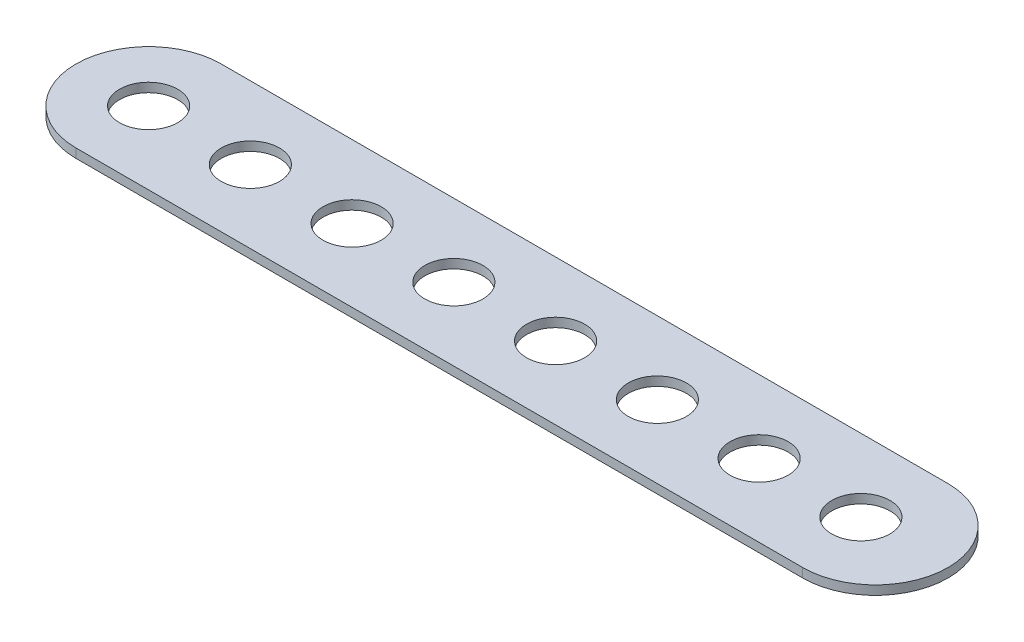
ISO-10303-21;
HEADER;
FILE_DESCRIPTION(('STEP AP214'),'2;1');
FILE_NAME('part.step','',(''),(''),'','','');
FILE_SCHEMA(('AUTOMOTIVE_DESIGN { 1 0 10303 214 1 1 1 1 }'));
ENDSEC;
DATA;
#1=APPLICATION_CONTEXT('core data for automotive mechanical design processes');
#2=APPLICATION_PROTOCOL_DEFINITION('international standard','automotive_design',2000,#1);
#3=PRODUCT_CONTEXT('',#1,'mechanical');
#4=PRODUCT('Part','Part','',(#3));
#5=PRODUCT_RELATED_PRODUCT_CATEGORY('part','',(#4));
#6=PRODUCT_DEFINITION_FORMATION('','',#4);
#7=PRODUCT_DEFINITION_CONTEXT('part definition',#1,'design');
#8=PRODUCT_DEFINITION('design','',#6,#7);
#9=PRODUCT_DEFINITION_SHAPE('','',#8);
#10=(LENGTH_UNIT() NAMED_UNIT(*) SI_UNIT(.MILLI.,.METRE.));
#11=(NAMED_UNIT(*) PLANE_ANGLE_UNIT() SI_UNIT($,.RADIAN.));
#12=(NAMED_UNIT(*) SI_UNIT($,.STERADIAN.) SOLID_ANGLE_UNIT());
#13=UNCERTAINTY_MEASURE_WITH_UNIT(LENGTH_MEASURE(1.E-05),#10,'distance_accuracy_value','');
#14=(GEOMETRIC_REPRESENTATION_CONTEXT(3) GLOBAL_UNCERTAINTY_ASSIGNED_CONTEXT((#13)) GLOBAL_UNIT_ASSIGNED_CONTEXT((#10,
#11,#12)) REPRESENTATION_CONTEXT('',''));
#15=CARTESIAN_POINT('',(0.,0.,0.));
#16=DIRECTION('',(0.,0.,1.));
#17=DIRECTION('',(1.,0.,0.));
#18=AXIS2_PLACEMENT_3D('',#15,#16,#17);
#19=CARTESIAN_POINT('',(-5.08000000000003,0.,0.));
#20=DIRECTION('',(0.,1.,0.));
#21=DIRECTION('',(0.,0.,1.));
#22=AXIS2_PLACEMENT_3D('',#19,#20,#21);
#23=CYLINDRICAL_SURFACE('',#22,10.16);
#24=CARTESIAN_POINT('',(-5.08000000000003,0.,0.));
#25=DIRECTION('',(0.,1.,0.));
#26=DIRECTION('',(0.,0.,1.));
#27=AXIS2_PLACEMENT_3D('',#24,#25,#26);
#28=CIRCLE('',#27,10.16);
#29=CARTESIAN_POINT('',(-5.08000000000003,0.,10.16));
#30=VERTEX_POINT('',#29);
#31=EDGE_CURVE('E47',#30,#30,#28,.T.);
#32=ORIENTED_EDGE('',*,*,#31,.F.);
#33=EDGE_LOOP('',(#32));
#34=FACE_BOUND('',#33,.T.);
#35=CARTESIAN_POINT('',(-5.08000000000003,3.175,0.));
#36=DIRECTION('',(0.,1.,0.));
#37=DIRECTION('',(0.,0.,1.));
#38=AXIS2_PLACEMENT_3D('',#35,#36,#37);
#39=CIRCLE('',#38,10.16);
#40=CARTESIAN_POINT('',(-5.08000000000003,3.175,10.16));
#41=VERTEX_POINT('',#40);
#42=EDGE_CURVE('E11',#41,#41,#39,.T.);
#43=ORIENTED_EDGE('',*,*,#42,.T.);
#44=EDGE_LOOP('',(#43));
#45=FACE_BOUND('',#44,.T.);
#46=ADVANCED_FACE('F38',(#34,#45),#23,.F.);
#47=CARTESIAN_POINT('',(-40.64,0.,0.));
#48=DIRECTION('',(0.,1.,0.));
#49=DIRECTION('',(0.,0.,1.));
#50=AXIS2_PLACEMENT_3D('',#47,#48,#49);
#51=CYLINDRICAL_SURFACE('',#50,10.16);
#52=CARTESIAN_POINT('',(-40.64,0.,0.));
#53=DIRECTION('',(0.,1.,0.));
#54=DIRECTION('',(0.,0.,1.));
#55=AXIS2_PLACEMENT_3D('',#52,#53,#54);
#56=CIRCLE('',#55,10.16);
#57=CARTESIAN_POINT('',(-40.64,0.,10.16));
#58=VERTEX_POINT('',#57);
#59=EDGE_CURVE('E167',#58,#58,#56,.T.);
#60=ORIENTED_EDGE('',*,*,#59,.F.);
#61=EDGE_LOOP('',(#60));
#62=FACE_BOUND('',#61,.T.);
#63=CARTESIAN_POINT('',(-40.64,3.175,0.));
#64=DIRECTION('',(0.,1.,0.));
#65=DIRECTION('',(0.,0.,1.));
#66=AXIS2_PLACEMENT_3D('',#63,#64,#65);
#67=CIRCLE('',#66,10.16);
#68=CARTESIAN_POINT('',(-40.64,3.175,10.16));
#69=VERTEX_POINT('',#68);
#70=EDGE_CURVE('E171',#69,#69,#67,.T.);
#71=ORIENTED_EDGE('',*,*,#70,.T.);
#72=EDGE_LOOP('',(#71));
#73=FACE_BOUND('',#72,.T.);
#74=ADVANCED_FACE('F183',(#62,#73),#51,.F.);
#75=CARTESIAN_POINT('',(-76.2,0.,0.));
#76=DIRECTION('',(0.,1.,0.));
#77=DIRECTION('',(0.,0.,1.));
#78=AXIS2_PLACEMENT_3D('',#75,#76,#77);
#79=CYLINDRICAL_SURFACE('',#78,10.16);
#80=CARTESIAN_POINT('',(-76.2,0.,0.));
#81=DIRECTION('',(0.,1.,0.));
#82=DIRECTION('',(0.,0.,1.));
#83=AXIS2_PLACEMENT_3D('',#80,#81,#82);
#84=CIRCLE('',#83,10.16);
#85=CARTESIAN_POINT('',(-76.2,0.,10.16));
#86=VERTEX_POINT('',#85);
#87=EDGE_CURVE('E159',#86,#86,#84,.T.);
#88=ORIENTED_EDGE('',*,*,#87,.F.);
#89=EDGE_LOOP('',(#88));
#90=FACE_BOUND('',#89,.T.);
#91=CARTESIAN_POINT('',(-76.2,3.175,0.));
#92=DIRECTION('',(0.,1.,0.));
#93=DIRECTION('',(0.,0.,1.));
#94=AXIS2_PLACEMENT_3D('',#91,#92,#93);
#95=CIRCLE('',#94,10.16);
#96=CARTESIAN_POINT('',(-76.2,3.175,10.16));
#97=VERTEX_POINT('',#96);
#98=EDGE_CURVE('E163',#97,#97,#95,.T.);
#99=ORIENTED_EDGE('',*,*,#98,.T.);
#100=EDGE_LOOP('',(#99));
#101=FACE_BOUND('',#100,.T.);
#102=ADVANCED_FACE('F249',(#90,#101),#79,.F.);
#103=CARTESIAN_POINT('',(-111.76,0.,0.));
#104=DIRECTION('',(0.,1.,0.));
#105=DIRECTION('',(0.,0.,1.));
#106=AXIS2_PLACEMENT_3D('',#103,#104,#105);
#107=CYLINDRICAL_SURFACE('',#106,10.16);
#108=CARTESIAN_POINT('',(-111.76,0.,0.));
#109=DIRECTION('',(0.,1.,0.));
#110=DIRECTION('',(0.,0.,1.));
#111=AXIS2_PLACEMENT_3D('',#108,#109,#110);
#112=CIRCLE('',#111,10.16);
#113=CARTESIAN_POINT('',(-111.76,0.,10.16));
#114=VERTEX_POINT('',#113);
#115=EDGE_CURVE('E151',#114,#114,#112,.T.);
#116=ORIENTED_EDGE('',*,*,#115,.F.);
#117=EDGE_LOOP('',(#116));
#118=FACE_BOUND('',#117,.T.);
#119=CARTESIAN_POINT('',(-111.76,3.175,0.));
#120=DIRECTION('',(0.,1.,0.));
#121=DIRECTION('',(0.,0.,1.));
#122=AXIS2_PLACEMENT_3D('',#119,#120,#121);
#123=CIRCLE('',#122,10.16);
#124=CARTESIAN_POINT('',(-111.76,3.175,10.16));
#125=VERTEX_POINT('',#124);
#126=EDGE_CURVE('E155',#125,#125,#123,.T.);
#127=ORIENTED_EDGE('',*,*,#126,.T.);
#128=EDGE_LOOP('',(#127));
#129=FACE_BOUND('',#128,.T.);
#130=ADVANCED_FACE('F245',(#118,#129),#107,.F.);
#131=CARTESIAN_POINT('',(-147.32,0.,0.));
#132=DIRECTION('',(0.,1.,0.));
#133=DIRECTION('',(0.,0.,1.));
#134=AXIS2_PLACEMENT_3D('',#131,#132,#133);
#135=CYLINDRICAL_SURFACE('',#134,10.16);
#136=CARTESIAN_POINT('',(-147.32,0.,0.));
#137=DIRECTION('',(0.,1.,0.));
#138=DIRECTION('',(0.,0.,1.));
#139=AXIS2_PLACEMENT_3D('',#136,#137,#138);
#140=CIRCLE('',#139,10.16);
#141=CARTESIAN_POINT('',(-147.32,0.,10.16));
#142=VERTEX_POINT('',#141);
#143=EDGE_CURVE('E143',#142,#142,#140,.T.);
#144=ORIENTED_EDGE('',*,*,#143,.F.);
#145=EDGE_LOOP('',(#144));
#146=FACE_BOUND('',#145,.T.);
#147=CARTESIAN_POINT('',(-147.32,3.175,0.));
#148=DIRECTION('',(0.,1.,0.));
#149=DIRECTION('',(0.,0.,1.));
#150=AXIS2_PLACEMENT_3D('',#147,#148,#149);
#151=CIRCLE('',#150,10.16);
#152=CARTESIAN_POINT('',(-147.32,3.175,10.16));
#153=VERTEX_POINT('',#152);
#154=EDGE_CURVE('E147',#153,#153,#151,.T.);
#155=ORIENTED_EDGE('',*,*,#154,.T.);
#156=EDGE_LOOP('',(#155));
#157=FACE_BOUND('',#156,.T.);
#158=ADVANCED_FACE('F241',(#146,#157),#135,.F.);
#159=CARTESIAN_POINT('',(-182.88,0.,0.));
#160=DIRECTION('',(0.,1.,0.));
#161=DIRECTION('',(0.,0.,1.));
#162=AXIS2_PLACEMENT_3D('',#159,#160,#161);
#163=CYLINDRICAL_SURFACE('',#162,10.16);
#164=CARTESIAN_POINT('',(-182.88,0.,0.));
#165=DIRECTION('',(0.,1.,0.));
#166=DIRECTION('',(0.,0.,1.));
#167=AXIS2_PLACEMENT_3D('',#164,#165,#166);
#168=CIRCLE('',#167,10.16);
#169=CARTESIAN_POINT('',(-182.88,0.,10.16));
#170=VERTEX_POINT('',#169);
#171=EDGE_CURVE('E135',#170,#170,#168,.T.);
#172=ORIENTED_EDGE('',*,*,#171,.F.);
#173=EDGE_LOOP('',(#172));
#174=FACE_BOUND('',#173,.T.);
#175=CARTESIAN_POINT('',(-182.88,3.175,0.));
#176=DIRECTION('',(0.,1.,0.));
#177=DIRECTION('',(0.,0.,1.));
#178=AXIS2_PLACEMENT_3D('',#175,#176,#177);
#179=CIRCLE('',#178,10.16);
#180=CARTESIAN_POINT('',(-182.88,3.175,10.16));
#181=VERTEX_POINT('',#180);
#182=EDGE_CURVE('E139',#181,#181,#179,.T.);
#183=ORIENTED_EDGE('',*,*,#182,.T.);
#184=EDGE_LOOP('',(#183));
#185=FACE_BOUND('',#184,.T.);
#186=ADVANCED_FACE('F237',(#174,#185),#163,.F.);
#187=CARTESIAN_POINT('',(-218.44,0.,0.));
#188=DIRECTION('',(0.,1.,0.));
#189=DIRECTION('',(0.,0.,1.));
#190=AXIS2_PLACEMENT_3D('',#187,#188,#189);
#191=CYLINDRICAL_SURFACE('',#190,10.16);
#192=CARTESIAN_POINT('',(-218.44,0.,0.));
#193=DIRECTION('',(0.,1.,0.));
#194=DIRECTION('',(0.,0.,1.));
#195=AXIS2_PLACEMENT_3D('',#192,#193,#194);
#196=CIRCLE('',#195,10.16);
#197=CARTESIAN_POINT('',(-218.44,0.,10.16));
#198=VERTEX_POINT('',#197);
#199=EDGE_CURVE('E127',#198,#198,#196,.T.);
#200=ORIENTED_EDGE('',*,*,#199,.F.);
#201=EDGE_LOOP('',(#200));
#202=FACE_BOUND('',#201,.T.);
#203=CARTESIAN_POINT('',(-218.44,3.175,0.));
#204=DIRECTION('',(0.,1.,0.));
#205=DIRECTION('',(0.,0.,1.));
#206=AXIS2_PLACEMENT_3D('',#203,#204,#205);
#207=CIRCLE('',#206,10.16);
#208=CARTESIAN_POINT('',(-218.44,3.175,10.16));
#209=VERTEX_POINT('',#208);
#210=EDGE_CURVE('E131',#209,#209,#207,.T.);
#211=ORIENTED_EDGE('',*,*,#210,.T.);
#212=EDGE_LOOP('',(#211));
#213=FACE_BOUND('',#212,.T.);
#214=ADVANCED_FACE('F233',(#202,#213),#191,.F.);
#215=CARTESIAN_POINT('',(0.,3.175,0.));
#216=DIRECTION('',(0.,-1.,0.));
#217=DIRECTION('',(0.,0.,-1.));
#218=AXIS2_PLACEMENT_3D('',#215,#216,#217);
#219=CYLINDRICAL_SURFACE('',#218,25.4);
#220=CARTESIAN_POINT('',(0.,0.,0.));
#221=DIRECTION('',(0.,1.,0.));
#222=DIRECTION('',(0.,0.,1.));
#223=AXIS2_PLACEMENT_3D('',#220,#221,#222);
#224=CIRCLE('',#223,25.4);
#225=CARTESIAN_POINT('',(0.,0.,25.4));
#226=VERTEX_POINT('',#225);
#227=CARTESIAN_POINT('',(0.,0.,-25.4));
#228=VERTEX_POINT('',#227);
#229=EDGE_CURVE('E110',#226,#228,#224,.T.);
#230=ORIENTED_EDGE('',*,*,#229,.T.);
#231=DIRECTION('',(0.,-1.,0.));
#232=VECTOR('',#231,1.);
#233=CARTESIAN_POINT('',(0.,3.175,-25.4));
#234=LINE('',#233,#232);
#235=CARTESIAN_POINT('',(0.,3.175,-25.4));
#236=VERTEX_POINT('',#235);
#237=EDGE_CURVE('E99',#236,#228,#234,.T.);
#238=ORIENTED_EDGE('',*,*,#237,.F.);
#239=CARTESIAN_POINT('',(0.,3.175,0.));
#240=DIRECTION('',(0.,1.,0.));
#241=DIRECTION('',(0.,0.,1.));
#242=AXIS2_PLACEMENT_3D('',#239,#240,#241);
#243=CIRCLE('',#242,25.4);
#244=CARTESIAN_POINT('',(0.,3.175,25.4));
#245=VERTEX_POINT('',#244);
#246=EDGE_CURVE('E91',#245,#236,#243,.T.);
#247=ORIENTED_EDGE('',*,*,#246,.F.);
#248=DIRECTION('',(0.,-1.,0.));
#249=VECTOR('',#248,1.);
#250=CARTESIAN_POINT('',(0.,3.175,25.4));
#251=LINE('',#250,#249);
#252=EDGE_CURVE('E106',#245,#226,#251,.T.);
#253=ORIENTED_EDGE('',*,*,#252,.T.);
#254=EDGE_LOOP('',(#230,#238,#247,#253));
#255=FACE_BOUND('',#254,.T.);
#256=ADVANCED_FACE('F230',(#255),#219,.T.);
#257=CARTESIAN_POINT('',(0.,3.175,-25.4));
#258=DIRECTION('',(0.,0.,1.));
#259=DIRECTION('',(1.,0.,0.));
#260=AXIS2_PLACEMENT_3D('',#257,#258,#259);
#261=PLANE('',#260);
#262=DIRECTION('',(-1.,0.,0.));
#263=VECTOR('',#262,1.);
#264=CARTESIAN_POINT('',(0.,0.,-25.4));
#265=LINE('',#264,#263);
#266=CARTESIAN_POINT('',(-254.,0.,-25.4));
#267=VERTEX_POINT('',#266);
#268=EDGE_CURVE('E97',#228,#267,#265,.T.);
#269=ORIENTED_EDGE('',*,*,#268,.T.);
#270=DIRECTION('',(0.,-1.,0.));
#271=VECTOR('',#270,1.);
#272=CARTESIAN_POINT('',(-254.,3.175,-25.4));
#273=LINE('',#272,#271);
#274=CARTESIAN_POINT('',(-254.,3.175,-25.4));
#275=VERTEX_POINT('',#274);
#276=EDGE_CURVE('E95',#275,#267,#273,.T.);
#277=ORIENTED_EDGE('',*,*,#276,.F.);
#278=DIRECTION('',(-1.,0.,0.));
#279=VECTOR('',#278,1.);
#280=CARTESIAN_POINT('',(0.,3.175,-25.4));
#281=LINE('',#280,#279);
#282=EDGE_CURVE('E86',#236,#275,#281,.T.);
#283=ORIENTED_EDGE('',*,*,#282,.F.);
#284=ORIENTED_EDGE('',*,*,#237,.T.);
#285=EDGE_LOOP('',(#269,#277,#283,#284));
#286=FACE_BOUND('',#285,.T.);
#287=ADVANCED_FACE('F96',(#286),#261,.F.);
#288=CARTESIAN_POINT('',(-254.,3.175,0.));
#289=DIRECTION('',(0.,-1.,0.));
#290=DIRECTION('',(0.,0.,-1.));
#291=AXIS2_PLACEMENT_3D('',#288,#289,#290);
#292=CYLINDRICAL_SURFACE('',#291,25.4);
#293=CARTESIAN_POINT('',(-254.,0.,0.));
#294=DIRECTION('',(0.,1.,0.));
#295=DIRECTION('',(0.,0.,1.));
#296=AXIS2_PLACEMENT_3D('',#293,#294,#295);
#297=CIRCLE('',#296,25.4);
#298=CARTESIAN_POINT('',(-254.,0.,25.4));
#299=VERTEX_POINT('',#298);
#300=EDGE_CURVE('E72',#267,#299,#297,.T.);
#301=ORIENTED_EDGE('',*,*,#300,.T.);
#302=DIRECTION('',(0.,-1.,0.));
#303=VECTOR('',#302,1.);
#304=CARTESIAN_POINT('',(-254.,3.175,25.4));
#305=LINE('',#304,#303);
#306=CARTESIAN_POINT('',(-254.,3.175,25.4));
#307=VERTEX_POINT('',#306);
#308=EDGE_CURVE('E100',#307,#299,#305,.T.);
#309=ORIENTED_EDGE('',*,*,#308,.F.);
#310=CARTESIAN_POINT('',(-254.,3.175,0.));
#311=DIRECTION('',(0.,1.,0.));
#312=DIRECTION('',(0.,0.,1.));
#313=AXIS2_PLACEMENT_3D('',#310,#311,#312);
#314=CIRCLE('',#313,25.4);
#315=EDGE_CURVE('E89',#275,#307,#314,.T.);
#316=ORIENTED_EDGE('',*,*,#315,.F.);
#317=ORIENTED_EDGE('',*,*,#276,.T.);
#318=EDGE_LOOP('',(#301,#309,#316,#317));
#319=FACE_BOUND('',#318,.T.);
#320=ADVANCED_FACE('F102',(#319),#292,.T.);
#321=CARTESIAN_POINT('',(0.,3.175,25.4));
#322=DIRECTION('',(0.,0.,-1.));
#323=DIRECTION('',(-1.,0.,0.));
#324=AXIS2_PLACEMENT_3D('',#321,#322,#323);
#325=PLANE('',#324);
#326=DIRECTION('',(1.,0.,0.));
#327=VECTOR('',#326,1.);
#328=CARTESIAN_POINT('',(0.,0.,25.4));
#329=LINE('',#328,#327);
#330=EDGE_CURVE('E78',#299,#226,#329,.T.);
#331=ORIENTED_EDGE('',*,*,#330,.T.);
#332=ORIENTED_EDGE('',*,*,#252,.F.);
#333=DIRECTION('',(1.,0.,0.));
#334=VECTOR('',#333,1.);
#335=CARTESIAN_POINT('',(0.,3.175,25.4));
#336=LINE('',#335,#334);
#337=EDGE_CURVE('E55',#307,#245,#336,.T.);
#338=ORIENTED_EDGE('',*,*,#337,.F.);
#339=ORIENTED_EDGE('',*,*,#308,.T.);
#340=EDGE_LOOP('',(#331,#332,#338,#339));
#341=FACE_BOUND('',#340,.T.);
#342=ADVANCED_FACE('F188',(#341),#325,.F.);
#343=CARTESIAN_POINT('',(0.,3.175,0.));
#344=DIRECTION('',(0.,1.,0.));
#345=DIRECTION('',(0.,0.,1.));
#346=AXIS2_PLACEMENT_3D('',#343,#344,#345);
#347=PLANE('',#346);
#348=ORIENTED_EDGE('',*,*,#42,.F.);
#349=EDGE_LOOP('',(#348));
#350=FACE_BOUND('',#349,.T.);
#351=ORIENTED_EDGE('',*,*,#70,.F.);
#352=EDGE_LOOP('',(#351));
#353=FACE_BOUND('',#352,.T.);
#354=ORIENTED_EDGE('',*,*,#98,.F.);
#355=EDGE_LOOP('',(#354));
#356=FACE_BOUND('',#355,.T.);
#357=ORIENTED_EDGE('',*,*,#126,.F.);
#358=EDGE_LOOP('',(#357));
#359=FACE_BOUND('',#358,.T.);
#360=ORIENTED_EDGE('',*,*,#154,.F.);
#361=EDGE_LOOP('',(#360));
#362=FACE_BOUND('',#361,.T.);
#363=ORIENTED_EDGE('',*,*,#182,.F.);
#364=EDGE_LOOP('',(#363));
#365=FACE_BOUND('',#364,.T.);
#366=ORIENTED_EDGE('',*,*,#210,.F.);
#367=EDGE_LOOP('',(#366));
#368=FACE_BOUND('',#367,.T.);
#369=CARTESIAN_POINT('',(-254.,3.175,0.));
#370=DIRECTION('',(0.,1.,0.));
#371=DIRECTION('',(0.,0.,1.));
#372=AXIS2_PLACEMENT_3D('',#369,#370,#371);
#373=CIRCLE('',#372,10.16);
#374=CARTESIAN_POINT('',(-254.,3.175,10.16));
#375=VERTEX_POINT('',#374);
#376=EDGE_CURVE('E204',#375,#375,#373,.T.);
#377=ORIENTED_EDGE('',*,*,#376,.F.);
#378=EDGE_LOOP('',(#377));
#379=FACE_BOUND('',#378,.T.);
#380=ORIENTED_EDGE('',*,*,#246,.T.);
#381=ORIENTED_EDGE('',*,*,#282,.T.);
#382=ORIENTED_EDGE('',*,*,#315,.T.);
#383=ORIENTED_EDGE('',*,*,#337,.T.);
#384=EDGE_LOOP('',(#380,#381,#382,#383));
#385=FACE_BOUND('',#384,.T.);
#386=ADVANCED_FACE('F87',(#350,#353,#356,#359,#362,#365,#368,#379,#385),#347,.T.);
#387=CARTESIAN_POINT('',(0.,0.,0.));
#388=DIRECTION('',(0.,1.,0.));
#389=DIRECTION('',(0.,0.,1.));
#390=AXIS2_PLACEMENT_3D('',#387,#388,#389);
#391=PLANE('',#390);
#392=ORIENTED_EDGE('',*,*,#31,.T.);
#393=EDGE_LOOP('',(#392));
#394=FACE_BOUND('',#393,.T.);
#395=ORIENTED_EDGE('',*,*,#59,.T.);
#396=EDGE_LOOP('',(#395));
#397=FACE_BOUND('',#396,.T.);
#398=ORIENTED_EDGE('',*,*,#87,.T.);
#399=EDGE_LOOP('',(#398));
#400=FACE_BOUND('',#399,.T.);
#401=ORIENTED_EDGE('',*,*,#115,.T.);
#402=EDGE_LOOP('',(#401));
#403=FACE_BOUND('',#402,.T.);
#404=ORIENTED_EDGE('',*,*,#143,.T.);
#405=EDGE_LOOP('',(#404));
#406=FACE_BOUND('',#405,.T.);
#407=ORIENTED_EDGE('',*,*,#171,.T.);
#408=EDGE_LOOP('',(#407));
#409=FACE_BOUND('',#408,.T.);
#410=ORIENTED_EDGE('',*,*,#199,.T.);
#411=EDGE_LOOP('',(#410));
#412=FACE_BOUND('',#411,.T.);
#413=CARTESIAN_POINT('',(-254.,0.,0.));
#414=DIRECTION('',(0.,1.,0.));
#415=DIRECTION('',(0.,0.,1.));
#416=AXIS2_PLACEMENT_3D('',#413,#414,#415);
#417=CIRCLE('',#416,10.16);
#418=CARTESIAN_POINT('',(-254.,0.,10.16));
#419=VERTEX_POINT('',#418);
#420=EDGE_CURVE('E114',#419,#419,#417,.T.);
#421=ORIENTED_EDGE('',*,*,#420,.T.);
#422=EDGE_LOOP('',(#421));
#423=FACE_BOUND('',#422,.T.);
#424=ORIENTED_EDGE('',*,*,#229,.F.);
#425=ORIENTED_EDGE('',*,*,#330,.F.);
#426=ORIENTED_EDGE('',*,*,#300,.F.);
#427=ORIENTED_EDGE('',*,*,#268,.F.);
#428=EDGE_LOOP('',(#424,#425,#426,#427));
#429=FACE_BOUND('',#428,.T.);
#430=ADVANCED_FACE('F178',(#394,#397,#400,#403,#406,#409,#412,#423,#429),#391,.F.);
#431=CARTESIAN_POINT('',(-254.,0.,0.));
#432=DIRECTION('',(0.,1.,0.));
#433=DIRECTION('',(0.,0.,1.));
#434=AXIS2_PLACEMENT_3D('',#431,#432,#433);
#435=CYLINDRICAL_SURFACE('',#434,10.16);
#436=ORIENTED_EDGE('',*,*,#420,.F.);
#437=EDGE_LOOP('',(#436));
#438=FACE_BOUND('',#437,.T.);
#439=ORIENTED_EDGE('',*,*,#376,.T.);
#440=EDGE_LOOP('',(#439));
#441=FACE_BOUND('',#440,.T.);
#442=ADVANCED_FACE('F216',(#438,#441),#435,.F.);
#443=CLOSED_SHELL('',(#46,#74,#102,#130,#158,#186,#214,#256,#287,#320,#342,#386,#430,#442));
#444=MANIFOLD_SOLID_BREP('B2',#443);
#445=ADVANCED_BREP_SHAPE_REPRESENTATION('',(#18,#444),#14);
#446=SHAPE_DEFINITION_REPRESENTATION(#9,#445);
ENDSEC;
END-ISO-10303-21;
